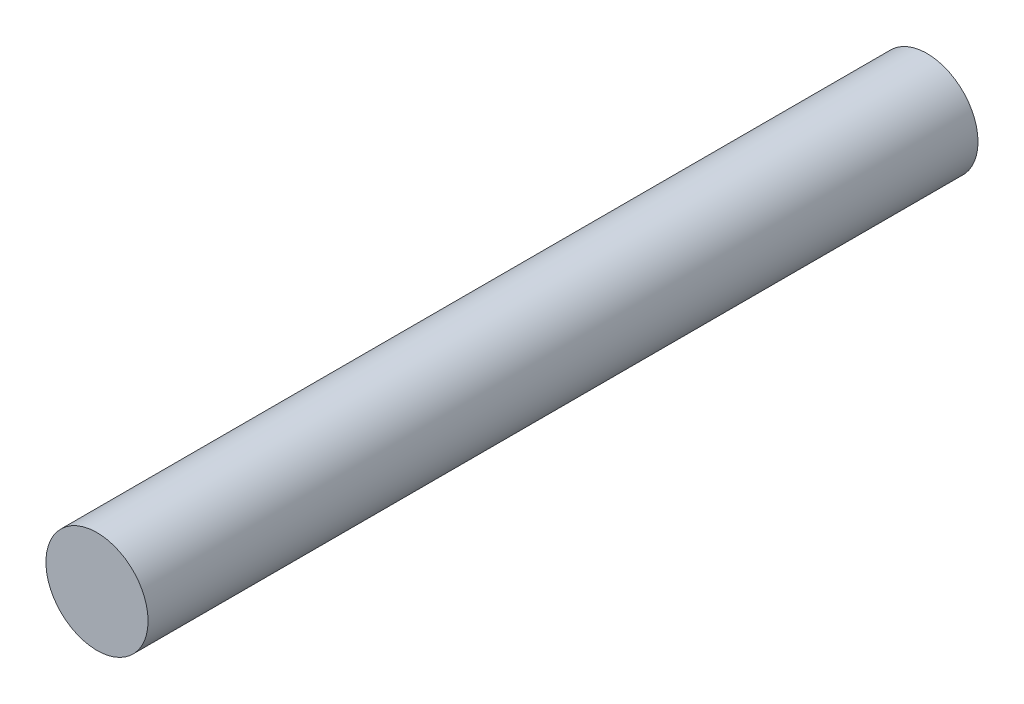
ISO-10303-21;
HEADER;
FILE_DESCRIPTION(('STEP AP214'),'2;1');
FILE_NAME('part.step','',(''),(''),'','','');
FILE_SCHEMA(('AUTOMOTIVE_DESIGN { 1 0 10303 214 1 1 1 1 }'));
ENDSEC;
DATA;
#1=APPLICATION_CONTEXT('core data for automotive mechanical design processes');
#2=APPLICATION_PROTOCOL_DEFINITION('international standard','automotive_design',2000,#1);
#3=PRODUCT_CONTEXT('',#1,'mechanical');
#4=PRODUCT('Part','Part','',(#3));
#5=PRODUCT_RELATED_PRODUCT_CATEGORY('part','',(#4));
#6=PRODUCT_DEFINITION_FORMATION('','',#4);
#7=PRODUCT_DEFINITION_CONTEXT('part definition',#1,'design');
#8=PRODUCT_DEFINITION('design','',#6,#7);
#9=PRODUCT_DEFINITION_SHAPE('','',#8);
#10=(LENGTH_UNIT() NAMED_UNIT(*) SI_UNIT(.MILLI.,.METRE.));
#11=(NAMED_UNIT(*) PLANE_ANGLE_UNIT() SI_UNIT($,.RADIAN.));
#12=(NAMED_UNIT(*) SI_UNIT($,.STERADIAN.) SOLID_ANGLE_UNIT());
#13=UNCERTAINTY_MEASURE_WITH_UNIT(LENGTH_MEASURE(1.E-05),#10,'distance_accuracy_value','');
#14=(GEOMETRIC_REPRESENTATION_CONTEXT(3) GLOBAL_UNCERTAINTY_ASSIGNED_CONTEXT((#13)) GLOBAL_UNIT_ASSIGNED_CONTEXT((#10,
#11,#12)) REPRESENTATION_CONTEXT('',''));
#15=CARTESIAN_POINT('',(0.,0.,0.));
#16=DIRECTION('',(0.,0.,1.));
#17=DIRECTION('',(1.,0.,0.));
#18=AXIS2_PLACEMENT_3D('',#15,#16,#17);
#19=CARTESIAN_POINT('',(0.,0.,32.5));
#20=DIRECTION('',(0.,0.,-1.));
#21=DIRECTION('',(-1.,0.,0.));
#22=AXIS2_PLACEMENT_3D('',#19,#20,#21);
#23=CYLINDRICAL_SURFACE('',#22,4.);
#24=CARTESIAN_POINT('',(0.,0.,32.5));
#25=DIRECTION('',(0.,0.,1.));
#26=DIRECTION('',(1.,0.,0.));
#27=AXIS2_PLACEMENT_3D('',#24,#25,#26);
#28=CIRCLE('',#27,4.);
#29=CARTESIAN_POINT('',(4.,0.,32.5));
#30=VERTEX_POINT('',#29);
#31=EDGE_CURVE('E10',#30,#30,#28,.T.);
#32=ORIENTED_EDGE('',*,*,#31,.F.);
#33=EDGE_LOOP('',(#32));
#34=FACE_BOUND('',#33,.T.);
#35=CARTESIAN_POINT('',(0.,0.,-32.5));
#36=DIRECTION('',(0.,0.,1.));
#37=DIRECTION('',(1.,0.,0.));
#38=AXIS2_PLACEMENT_3D('',#35,#36,#37);
#39=CIRCLE('',#38,4.);
#40=CARTESIAN_POINT('',(4.,0.,-32.5));
#41=VERTEX_POINT('',#40);
#42=EDGE_CURVE('E40',#41,#41,#39,.T.);
#43=ORIENTED_EDGE('',*,*,#42,.T.);
#44=EDGE_LOOP('',(#43));
#45=FACE_BOUND('',#44,.T.);
#46=ADVANCED_FACE('F37',(#34,#45),#23,.T.);
#47=CARTESIAN_POINT('',(0.,0.,32.5));
#48=DIRECTION('',(0.,0.,1.));
#49=DIRECTION('',(1.,0.,0.));
#50=AXIS2_PLACEMENT_3D('',#47,#48,#49);
#51=PLANE('',#50);
#52=ORIENTED_EDGE('',*,*,#31,.T.);
#53=EDGE_LOOP('',(#52));
#54=FACE_BOUND('',#53,.T.);
#55=ADVANCED_FACE('F52',(#54),#51,.T.);
#56=CARTESIAN_POINT('',(0.,0.,-32.5));
#57=DIRECTION('',(0.,0.,1.));
#58=DIRECTION('',(1.,0.,0.));
#59=AXIS2_PLACEMENT_3D('',#56,#57,#58);
#60=PLANE('',#59);
#61=ORIENTED_EDGE('',*,*,#42,.F.);
#62=EDGE_LOOP('',(#61));
#63=FACE_BOUND('',#62,.T.);
#64=ADVANCED_FACE('F50',(#63),#60,.F.);
#65=CLOSED_SHELL('',(#46,#55,#64));
#66=MANIFOLD_SOLID_BREP('B2',#65);
#67=ADVANCED_BREP_SHAPE_REPRESENTATION('',(#18,#66),#14);
#68=SHAPE_DEFINITION_REPRESENTATION(#9,#67);
ENDSEC;
END-ISO-10303-21;
